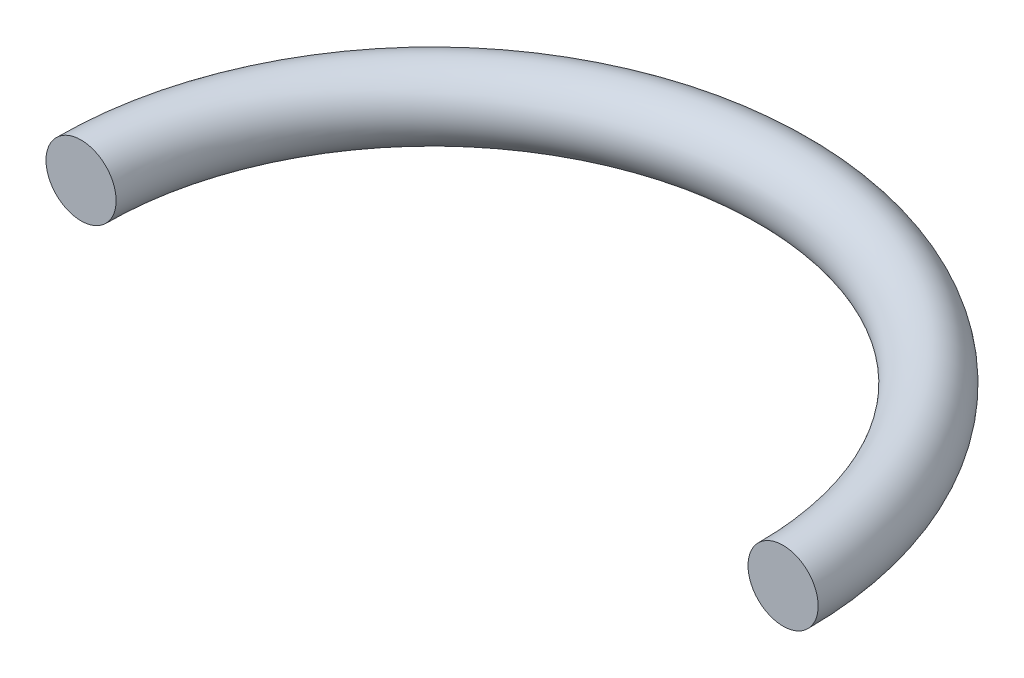
ISO-10303-21;
HEADER;
FILE_DESCRIPTION(('STEP AP214'),'2;1');
FILE_NAME('part.step','',(''),(''),'','','');
FILE_SCHEMA(('AUTOMOTIVE_DESIGN { 1 0 10303 214 1 1 1 1 }'));
ENDSEC;
DATA;
#1=APPLICATION_CONTEXT('core data for automotive mechanical design processes');
#2=APPLICATION_PROTOCOL_DEFINITION('international standard','automotive_design',2000,#1);
#3=PRODUCT_CONTEXT('',#1,'mechanical');
#4=PRODUCT('Part','Part','',(#3));
#5=PRODUCT_RELATED_PRODUCT_CATEGORY('part','',(#4));
#6=PRODUCT_DEFINITION_FORMATION('','',#4);
#7=PRODUCT_DEFINITION_CONTEXT('part definition',#1,'design');
#8=PRODUCT_DEFINITION('design','',#6,#7);
#9=PRODUCT_DEFINITION_SHAPE('','',#8);
#10=(LENGTH_UNIT() NAMED_UNIT(*) SI_UNIT(.MILLI.,.METRE.));
#11=(NAMED_UNIT(*) PLANE_ANGLE_UNIT() SI_UNIT($,.RADIAN.));
#12=(NAMED_UNIT(*) SI_UNIT($,.STERADIAN.) SOLID_ANGLE_UNIT());
#13=UNCERTAINTY_MEASURE_WITH_UNIT(LENGTH_MEASURE(1.E-05),#10,'distance_accuracy_value','');
#14=(GEOMETRIC_REPRESENTATION_CONTEXT(3) GLOBAL_UNCERTAINTY_ASSIGNED_CONTEXT((#13)) GLOBAL_UNIT_ASSIGNED_CONTEXT((#10,
#11,#12)) REPRESENTATION_CONTEXT('',''));
#15=CARTESIAN_POINT('',(0.,0.,0.));
#16=DIRECTION('',(0.,0.,1.));
#17=DIRECTION('',(1.,0.,0.));
#18=AXIS2_PLACEMENT_3D('',#15,#16,#17);
#19=CARTESIAN_POINT('',(0.,0.,0.));
#20=DIRECTION('',(0.,-1.,0.));
#21=DIRECTION('',(0.,0.,-1.));
#22=AXIS2_PLACEMENT_3D('',#19,#20,#21);
#23=TOROIDAL_SURFACE('',#22,7.5,0.749394306927303);
#24=CARTESIAN_POINT('',(-7.5,0.,0.));
#25=DIRECTION('',(0.,0.,-1.));
#26=DIRECTION('',(-1.,0.,0.));
#27=AXIS2_PLACEMENT_3D('',#24,#25,#26);
#28=CIRCLE('',#27,0.749394306927303);
#29=CARTESIAN_POINT('',(-8.2493943069273,0.,0.));
#30=VERTEX_POINT('',#29);
#31=EDGE_CURVE('E10',#30,#30,#28,.T.);
#32=CARTESIAN_POINT('',(7.5,0.,0.));
#33=DIRECTION('',(0.,0.,1.));
#34=DIRECTION('',(1.,0.,0.));
#35=AXIS2_PLACEMENT_3D('',#32,#33,#34);
#36=CIRCLE('',#35,0.749394306927303);
#37=CARTESIAN_POINT('',(8.2493943069273,0.,0.));
#38=VERTEX_POINT('',#37);
#39=EDGE_CURVE('E36',#38,#38,#36,.T.);
#40=CARTESIAN_POINT('',(0.,0.,0.));
#41=DIRECTION('',(0.,-1.,0.));
#42=DIRECTION('',(0.,0.,-1.));
#43=AXIS2_PLACEMENT_3D('',#40,#41,#42);
#44=CIRCLE('',#43,8.2493943069273);
#45=EDGE_CURVE('',#30,#38,#44,.T.);
#46=ORIENTED_EDGE('',*,*,#31,.T.);
#47=ORIENTED_EDGE('',*,*,#39,.F.);
#48=ORIENTED_EDGE('',*,*,#45,.T.);
#49=ORIENTED_EDGE('',*,*,#45,.F.);
#50=EDGE_LOOP('',(#46,#48,#47,#49));
#51=FACE_BOUND('',#50,.T.);
#52=ADVANCED_FACE('F30',(#51),#23,.T.);
#53=CARTESIAN_POINT('',(-7.5,0.,0.));
#54=DIRECTION('',(0.,0.,-1.));
#55=DIRECTION('',(-1.,0.,0.));
#56=AXIS2_PLACEMENT_3D('',#53,#54,#55);
#57=PLANE('',#56);
#58=ORIENTED_EDGE('',*,*,#31,.F.);
#59=EDGE_LOOP('',(#58));
#60=FACE_BOUND('',#59,.T.);
#61=ADVANCED_FACE('F45',(#60),#57,.F.);
#62=CARTESIAN_POINT('',(7.5,0.,0.));
#63=DIRECTION('',(0.,0.,1.));
#64=DIRECTION('',(1.,0.,0.));
#65=AXIS2_PLACEMENT_3D('',#62,#63,#64);
#66=PLANE('',#65);
#67=ORIENTED_EDGE('',*,*,#39,.T.);
#68=EDGE_LOOP('',(#67));
#69=FACE_BOUND('',#68,.T.);
#70=ADVANCED_FACE('F42',(#69),#66,.T.);
#71=CLOSED_SHELL('',(#52,#61,#70));
#72=MANIFOLD_SOLID_BREP('B2',#71);
#73=ADVANCED_BREP_SHAPE_REPRESENTATION('',(#18,#72),#14);
#74=SHAPE_DEFINITION_REPRESENTATION(#9,#73);
ENDSEC;
END-ISO-10303-21;
